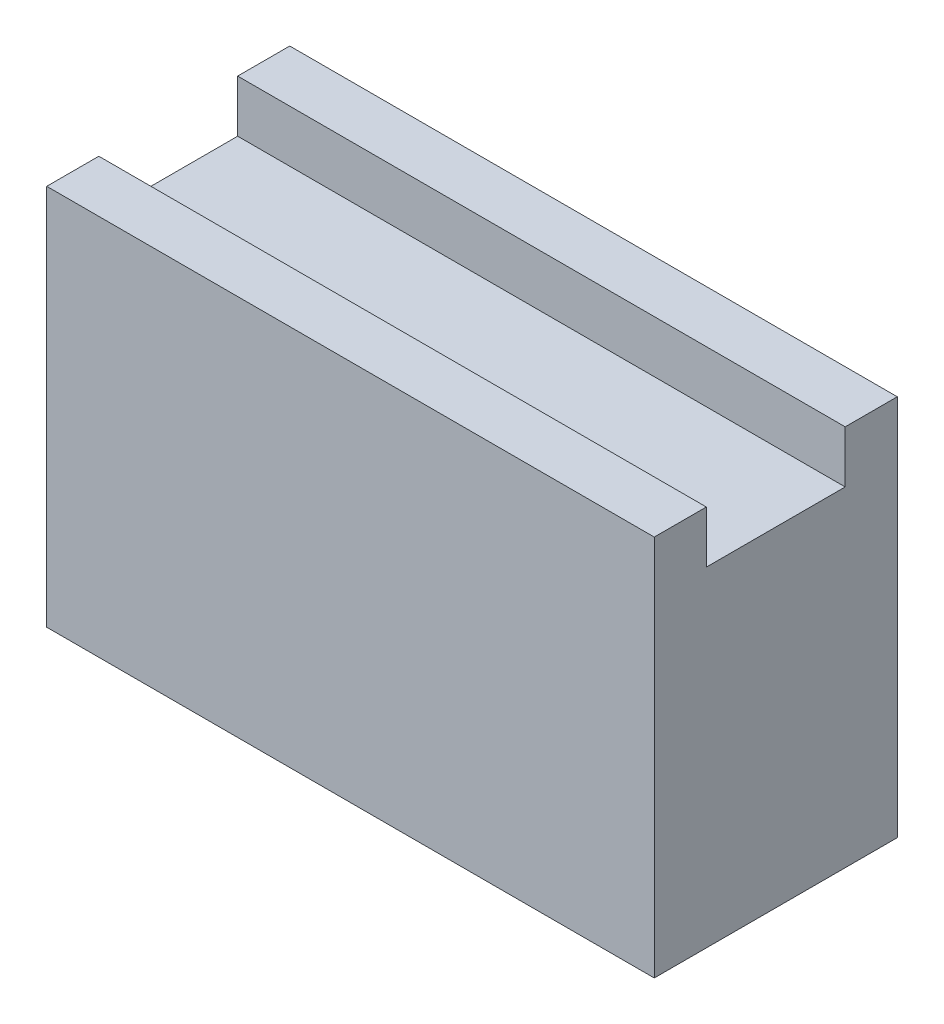
ISO-10303-21;
HEADER;
FILE_DESCRIPTION(('STEP AP214'),'2;1');
FILE_NAME('part.step','',(''),(''),'','','');
FILE_SCHEMA(('AUTOMOTIVE_DESIGN { 1 0 10303 214 1 1 1 1 }'));
ENDSEC;
DATA;
#1=APPLICATION_CONTEXT('core data for automotive mechanical design processes');
#2=APPLICATION_PROTOCOL_DEFINITION('international standard','automotive_design',2000,#1);
#3=PRODUCT_CONTEXT('',#1,'mechanical');
#4=PRODUCT('Part','Part','',(#3));
#5=PRODUCT_RELATED_PRODUCT_CATEGORY('part','',(#4));
#6=PRODUCT_DEFINITION_FORMATION('','',#4);
#7=PRODUCT_DEFINITION_CONTEXT('part definition',#1,'design');
#8=PRODUCT_DEFINITION('design','',#6,#7);
#9=PRODUCT_DEFINITION_SHAPE('','',#8);
#10=(LENGTH_UNIT() NAMED_UNIT(*) SI_UNIT(.MILLI.,.METRE.));
#11=(NAMED_UNIT(*) PLANE_ANGLE_UNIT() SI_UNIT($,.RADIAN.));
#12=(NAMED_UNIT(*) SI_UNIT($,.STERADIAN.) SOLID_ANGLE_UNIT());
#13=UNCERTAINTY_MEASURE_WITH_UNIT(LENGTH_MEASURE(1.E-05),#10,'distance_accuracy_value','');
#14=(GEOMETRIC_REPRESENTATION_CONTEXT(3) GLOBAL_UNCERTAINTY_ASSIGNED_CONTEXT((#13)) GLOBAL_UNIT_ASSIGNED_CONTEXT((#10,
#11,#12)) REPRESENTATION_CONTEXT('',''));
#15=CARTESIAN_POINT('',(0.,0.,0.));
#16=DIRECTION('',(0.,0.,1.));
#17=DIRECTION('',(1.,0.,0.));
#18=AXIS2_PLACEMENT_3D('',#15,#16,#17);
#19=CARTESIAN_POINT('',(-35.,-9.5,-7.));
#20=DIRECTION('',(0.,0.,-1.));
#21=DIRECTION('',(-1.,0.,0.));
#22=AXIS2_PLACEMENT_3D('',#19,#20,#21);
#23=PLANE('',#22);
#24=DIRECTION('',(0.,1.,0.));
#25=VECTOR('',#24,1.);
#26=CARTESIAN_POINT('',(0.,-9.5,-7.));
#27=LINE('',#26,#25);
#28=CARTESIAN_POINT('',(0.,-9.5,-7.));
#29=VERTEX_POINT('',#28);
#30=CARTESIAN_POINT('',(0.,12.5,-7.));
#31=VERTEX_POINT('',#30);
#32=EDGE_CURVE('E155',#29,#31,#27,.T.);
#33=ORIENTED_EDGE('',*,*,#32,.F.);
#34=DIRECTION('',(1.,0.,0.));
#35=VECTOR('',#34,1.);
#36=CARTESIAN_POINT('',(-35.,-9.5,-7.));
#37=LINE('',#36,#35);
#38=CARTESIAN_POINT('',(-35.,-9.5,-7.));
#39=VERTEX_POINT('',#38);
#40=EDGE_CURVE('E11',#39,#29,#37,.T.);
#41=ORIENTED_EDGE('',*,*,#40,.F.);
#42=DIRECTION('',(0.,1.,0.));
#43=VECTOR('',#42,1.);
#44=CARTESIAN_POINT('',(-35.,9.5,-7.));
#45=LINE('',#44,#43);
#46=CARTESIAN_POINT('',(-35.,12.5,-7.));
#47=VERTEX_POINT('',#46);
#48=EDGE_CURVE('E58',#39,#47,#45,.T.);
#49=ORIENTED_EDGE('',*,*,#48,.T.);
#50=DIRECTION('',(1.,0.,0.));
#51=VECTOR('',#50,1.);
#52=CARTESIAN_POINT('',(-35.,12.5,-7.));
#53=LINE('',#52,#51);
#54=EDGE_CURVE('E43',#47,#31,#53,.T.);
#55=ORIENTED_EDGE('',*,*,#54,.T.);
#56=EDGE_LOOP('',(#33,#41,#49,#55));
#57=FACE_BOUND('',#56,.T.);
#58=ADVANCED_FACE('F39',(#57),#23,.T.);
#59=CARTESIAN_POINT('',(-35.,-9.5,7.));
#60=DIRECTION('',(0.,-1.,0.));
#61=DIRECTION('',(0.,0.,-1.));
#62=AXIS2_PLACEMENT_3D('',#59,#60,#61);
#63=PLANE('',#62);
#64=DIRECTION('',(0.,0.,-1.));
#65=VECTOR('',#64,1.);
#66=CARTESIAN_POINT('',(0.,-9.5,7.));
#67=LINE('',#66,#65);
#68=CARTESIAN_POINT('',(0.,-9.5,7.));
#69=VERTEX_POINT('',#68);
#70=EDGE_CURVE('E153',#69,#29,#67,.T.);
#71=ORIENTED_EDGE('',*,*,#70,.F.);
#72=DIRECTION('',(1.,0.,0.));
#73=VECTOR('',#72,1.);
#74=CARTESIAN_POINT('',(-35.,-9.5,7.));
#75=LINE('',#74,#73);
#76=CARTESIAN_POINT('',(-35.,-9.5,7.));
#77=VERTEX_POINT('',#76);
#78=EDGE_CURVE('E49',#77,#69,#75,.T.);
#79=ORIENTED_EDGE('',*,*,#78,.F.);
#80=DIRECTION('',(0.,0.,-1.));
#81=VECTOR('',#80,1.);
#82=CARTESIAN_POINT('',(-35.,-9.5,7.));
#83=LINE('',#82,#81);
#84=EDGE_CURVE('E128',#77,#39,#83,.T.);
#85=ORIENTED_EDGE('',*,*,#84,.T.);
#86=ORIENTED_EDGE('',*,*,#40,.T.);
#87=EDGE_LOOP('',(#71,#79,#85,#86));
#88=FACE_BOUND('',#87,.T.);
#89=ADVANCED_FACE('F168',(#88),#63,.T.);
#90=CARTESIAN_POINT('',(-35.,-9.5,7.));
#91=DIRECTION('',(0.,0.,1.));
#92=DIRECTION('',(1.,0.,0.));
#93=AXIS2_PLACEMENT_3D('',#90,#91,#92);
#94=PLANE('',#93);
#95=DIRECTION('',(0.,-1.,0.));
#96=VECTOR('',#95,1.);
#97=CARTESIAN_POINT('',(0.,-9.5,7.));
#98=LINE('',#97,#96);
#99=CARTESIAN_POINT('',(0.,12.5,7.));
#100=VERTEX_POINT('',#99);
#101=EDGE_CURVE('E116',#100,#69,#98,.T.);
#102=ORIENTED_EDGE('',*,*,#101,.F.);
#103=DIRECTION('',(1.,0.,0.));
#104=VECTOR('',#103,1.);
#105=CARTESIAN_POINT('',(-35.,12.5,7.));
#106=LINE('',#105,#104);
#107=CARTESIAN_POINT('',(-35.,12.5,7.));
#108=VERTEX_POINT('',#107);
#109=EDGE_CURVE('E111',#108,#100,#106,.T.);
#110=ORIENTED_EDGE('',*,*,#109,.F.);
#111=DIRECTION('',(0.,-1.,0.));
#112=VECTOR('',#111,1.);
#113=CARTESIAN_POINT('',(-35.,9.5,7.));
#114=LINE('',#113,#112);
#115=EDGE_CURVE('E114',#108,#77,#114,.T.);
#116=ORIENTED_EDGE('',*,*,#115,.T.);
#117=ORIENTED_EDGE('',*,*,#78,.T.);
#118=EDGE_LOOP('',(#102,#110,#116,#117));
#119=FACE_BOUND('',#118,.T.);
#120=ADVANCED_FACE('F113',(#119),#94,.T.);
#121=CARTESIAN_POINT('',(-35.,12.5,7.));
#122=DIRECTION('',(0.,1.,0.));
#123=DIRECTION('',(0.,0.,1.));
#124=AXIS2_PLACEMENT_3D('',#121,#122,#123);
#125=PLANE('',#124);
#126=DIRECTION('',(0.,0.,1.));
#127=VECTOR('',#126,1.);
#128=CARTESIAN_POINT('',(0.,12.5,7.));
#129=LINE('',#128,#127);
#130=CARTESIAN_POINT('',(0.,12.5,4.));
#131=VERTEX_POINT('',#130);
#132=EDGE_CURVE('E150',#131,#100,#129,.T.);
#133=ORIENTED_EDGE('',*,*,#132,.F.);
#134=DIRECTION('',(1.,0.,0.));
#135=VECTOR('',#134,1.);
#136=CARTESIAN_POINT('',(-35.,12.5,4.));
#137=LINE('',#136,#135);
#138=CARTESIAN_POINT('',(-35.,12.5,4.));
#139=VERTEX_POINT('',#138);
#140=EDGE_CURVE('E121',#139,#131,#137,.T.);
#141=ORIENTED_EDGE('',*,*,#140,.F.);
#142=DIRECTION('',(0.,0.,1.));
#143=VECTOR('',#142,1.);
#144=CARTESIAN_POINT('',(-35.,12.5,7.));
#145=LINE('',#144,#143);
#146=EDGE_CURVE('E126',#139,#108,#145,.T.);
#147=ORIENTED_EDGE('',*,*,#146,.T.);
#148=ORIENTED_EDGE('',*,*,#109,.T.);
#149=EDGE_LOOP('',(#133,#141,#147,#148));
#150=FACE_BOUND('',#149,.T.);
#151=ADVANCED_FACE('F130',(#150),#125,.T.);
#152=CARTESIAN_POINT('',(-35.,12.5,4.));
#153=DIRECTION('',(0.,0.,-1.));
#154=DIRECTION('',(0.,1.,0.));
#155=AXIS2_PLACEMENT_3D('',#152,#153,#154);
#156=PLANE('',#155);
#157=DIRECTION('',(0.,1.,0.));
#158=VECTOR('',#157,1.);
#159=CARTESIAN_POINT('',(0.,12.5,4.));
#160=LINE('',#159,#158);
#161=CARTESIAN_POINT('',(0.,9.5,4.));
#162=VERTEX_POINT('',#161);
#163=EDGE_CURVE('E147',#162,#131,#160,.T.);
#164=ORIENTED_EDGE('',*,*,#163,.F.);
#165=DIRECTION('',(1.,0.,0.));
#166=VECTOR('',#165,1.);
#167=CARTESIAN_POINT('',(-35.,9.5,4.));
#168=LINE('',#167,#166);
#169=CARTESIAN_POINT('',(-35.,9.5,4.));
#170=VERTEX_POINT('',#169);
#171=EDGE_CURVE('E159',#170,#162,#168,.T.);
#172=ORIENTED_EDGE('',*,*,#171,.F.);
#173=DIRECTION('',(0.,1.,0.));
#174=VECTOR('',#173,1.);
#175=CARTESIAN_POINT('',(-35.,12.5,4.));
#176=LINE('',#175,#174);
#177=EDGE_CURVE('E131',#170,#139,#176,.T.);
#178=ORIENTED_EDGE('',*,*,#177,.T.);
#179=ORIENTED_EDGE('',*,*,#140,.T.);
#180=EDGE_LOOP('',(#164,#172,#178,#179));
#181=FACE_BOUND('',#180,.T.);
#182=ADVANCED_FACE('F181',(#181),#156,.T.);
#183=CARTESIAN_POINT('',(-35.,9.5,4.));
#184=DIRECTION('',(0.,1.,0.));
#185=DIRECTION('',(0.,0.,1.));
#186=AXIS2_PLACEMENT_3D('',#183,#184,#185);
#187=PLANE('',#186);
#188=DIRECTION('',(0.,0.,1.));
#189=VECTOR('',#188,1.);
#190=CARTESIAN_POINT('',(0.,9.5,4.));
#191=LINE('',#190,#189);
#192=CARTESIAN_POINT('',(0.,9.5,-4.));
#193=VERTEX_POINT('',#192);
#194=EDGE_CURVE('E144',#193,#162,#191,.T.);
#195=ORIENTED_EDGE('',*,*,#194,.F.);
#196=DIRECTION('',(1.,0.,0.));
#197=VECTOR('',#196,1.);
#198=CARTESIAN_POINT('',(-35.,9.5,-4.));
#199=LINE('',#198,#197);
#200=CARTESIAN_POINT('',(-35.,9.5,-4.));
#201=VERTEX_POINT('',#200);
#202=EDGE_CURVE('E161',#201,#193,#199,.T.);
#203=ORIENTED_EDGE('',*,*,#202,.F.);
#204=DIRECTION('',(0.,0.,1.));
#205=VECTOR('',#204,1.);
#206=CARTESIAN_POINT('',(-35.,9.5,4.));
#207=LINE('',#206,#205);
#208=EDGE_CURVE('E133',#201,#170,#207,.T.);
#209=ORIENTED_EDGE('',*,*,#208,.T.);
#210=ORIENTED_EDGE('',*,*,#171,.T.);
#211=EDGE_LOOP('',(#195,#203,#209,#210));
#212=FACE_BOUND('',#211,.T.);
#213=ADVANCED_FACE('F184',(#212),#187,.T.);
#214=CARTESIAN_POINT('',(-35.,12.5,-4.));
#215=DIRECTION('',(0.,0.,1.));
#216=DIRECTION('',(0.,-1.,0.));
#217=AXIS2_PLACEMENT_3D('',#214,#215,#216);
#218=PLANE('',#217);
#219=DIRECTION('',(0.,-1.,0.));
#220=VECTOR('',#219,1.);
#221=CARTESIAN_POINT('',(0.,12.5,-4.));
#222=LINE('',#221,#220);
#223=CARTESIAN_POINT('',(0.,12.5,-4.));
#224=VERTEX_POINT('',#223);
#225=EDGE_CURVE('E141',#224,#193,#222,.T.);
#226=ORIENTED_EDGE('',*,*,#225,.F.);
#227=DIRECTION('',(1.,0.,0.));
#228=VECTOR('',#227,1.);
#229=CARTESIAN_POINT('',(-35.,12.5,-4.));
#230=LINE('',#229,#228);
#231=CARTESIAN_POINT('',(-35.,12.5,-4.));
#232=VERTEX_POINT('',#231);
#233=EDGE_CURVE('E162',#232,#224,#230,.T.);
#234=ORIENTED_EDGE('',*,*,#233,.F.);
#235=DIRECTION('',(0.,-1.,0.));
#236=VECTOR('',#235,1.);
#237=CARTESIAN_POINT('',(-35.,12.5,-4.));
#238=LINE('',#237,#236);
#239=EDGE_CURVE('E197',#232,#201,#238,.T.);
#240=ORIENTED_EDGE('',*,*,#239,.T.);
#241=ORIENTED_EDGE('',*,*,#202,.T.);
#242=EDGE_LOOP('',(#226,#234,#240,#241));
#243=FACE_BOUND('',#242,.T.);
#244=ADVANCED_FACE('F187',(#243),#218,.T.);
#245=CARTESIAN_POINT('',(-35.,12.5,-7.));
#246=DIRECTION('',(0.,1.,0.));
#247=DIRECTION('',(0.,0.,1.));
#248=AXIS2_PLACEMENT_3D('',#245,#246,#247);
#249=PLANE('',#248);
#250=DIRECTION('',(0.,0.,1.));
#251=VECTOR('',#250,1.);
#252=CARTESIAN_POINT('',(0.,12.5,-7.));
#253=LINE('',#252,#251);
#254=EDGE_CURVE('E138',#31,#224,#253,.T.);
#255=ORIENTED_EDGE('',*,*,#254,.F.);
#256=ORIENTED_EDGE('',*,*,#54,.F.);
#257=DIRECTION('',(0.,0.,1.));
#258=VECTOR('',#257,1.);
#259=CARTESIAN_POINT('',(-35.,12.5,-7.));
#260=LINE('',#259,#258);
#261=EDGE_CURVE('E201',#47,#232,#260,.T.);
#262=ORIENTED_EDGE('',*,*,#261,.T.);
#263=ORIENTED_EDGE('',*,*,#233,.T.);
#264=EDGE_LOOP('',(#255,#256,#262,#263));
#265=FACE_BOUND('',#264,.T.);
#266=ADVANCED_FACE('F41',(#265),#249,.T.);
#267=CARTESIAN_POINT('',(-35.,0.,0.));
#268=DIRECTION('',(1.,0.,0.));
#269=DIRECTION('',(0.,0.,-1.));
#270=AXIS2_PLACEMENT_3D('',#267,#268,#269);
#271=PLANE('',#270);
#272=ORIENTED_EDGE('',*,*,#48,.F.);
#273=ORIENTED_EDGE('',*,*,#84,.F.);
#274=ORIENTED_EDGE('',*,*,#115,.F.);
#275=ORIENTED_EDGE('',*,*,#146,.F.);
#276=ORIENTED_EDGE('',*,*,#177,.F.);
#277=ORIENTED_EDGE('',*,*,#208,.F.);
#278=ORIENTED_EDGE('',*,*,#239,.F.);
#279=ORIENTED_EDGE('',*,*,#261,.F.);
#280=EDGE_LOOP('',(#272,#273,#274,#275,#276,#277,#278,#279));
#281=FACE_BOUND('',#280,.T.);
#282=ADVANCED_FACE('F124',(#281),#271,.F.);
#283=CARTESIAN_POINT('',(0.,0.,0.));
#284=DIRECTION('',(1.,0.,0.));
#285=DIRECTION('',(0.,0.,-1.));
#286=AXIS2_PLACEMENT_3D('',#283,#284,#285);
#287=PLANE('',#286);
#288=ORIENTED_EDGE('',*,*,#32,.T.);
#289=ORIENTED_EDGE('',*,*,#254,.T.);
#290=ORIENTED_EDGE('',*,*,#225,.T.);
#291=ORIENTED_EDGE('',*,*,#194,.T.);
#292=ORIENTED_EDGE('',*,*,#163,.T.);
#293=ORIENTED_EDGE('',*,*,#132,.T.);
#294=ORIENTED_EDGE('',*,*,#101,.T.);
#295=ORIENTED_EDGE('',*,*,#70,.T.);
#296=EDGE_LOOP('',(#288,#289,#290,#291,#292,#293,#294,#295));
#297=FACE_BOUND('',#296,.T.);
#298=ADVANCED_FACE('F167',(#297),#287,.T.);
#299=CLOSED_SHELL('',(#58,#89,#120,#151,#182,#213,#244,#266,#282,#298));
#300=MANIFOLD_SOLID_BREP('B2',#299);
#301=ADVANCED_BREP_SHAPE_REPRESENTATION('',(#18,#300),#14);
#302=SHAPE_DEFINITION_REPRESENTATION(#9,#301);
ENDSEC;
END-ISO-10303-21;
